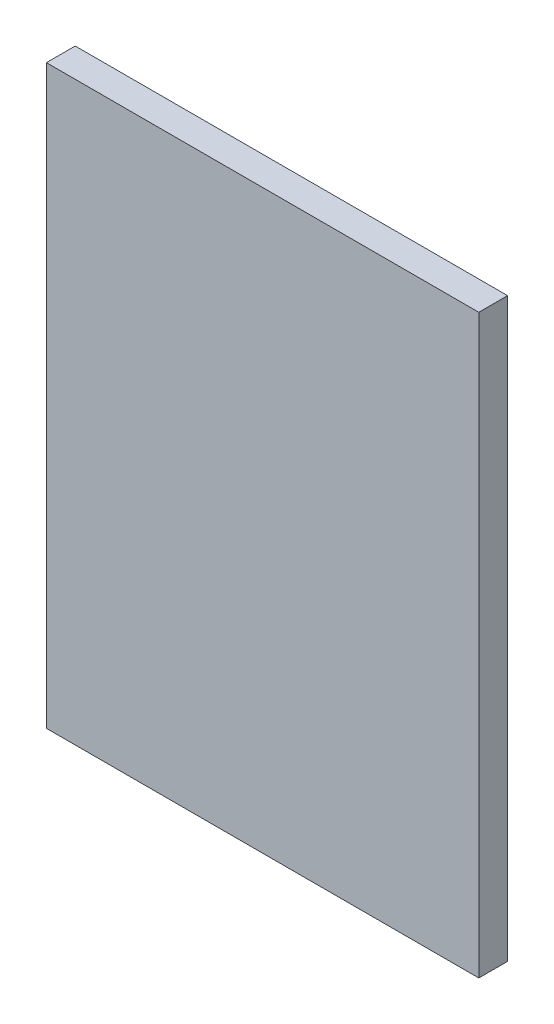
ISO-10303-21;
HEADER;
FILE_DESCRIPTION(('STEP AP214'),'2;1');
FILE_NAME('part.step','',(''),(''),'','','');
FILE_SCHEMA(('AUTOMOTIVE_DESIGN { 1 0 10303 214 1 1 1 1 }'));
ENDSEC;
DATA;
#1=APPLICATION_CONTEXT('core data for automotive mechanical design processes');
#2=APPLICATION_PROTOCOL_DEFINITION('international standard','automotive_design',2000,#1);
#3=PRODUCT_CONTEXT('',#1,'mechanical');
#4=PRODUCT('Part','Part','',(#3));
#5=PRODUCT_RELATED_PRODUCT_CATEGORY('part','',(#4));
#6=PRODUCT_DEFINITION_FORMATION('','',#4);
#7=PRODUCT_DEFINITION_CONTEXT('part definition',#1,'design');
#8=PRODUCT_DEFINITION('design','',#6,#7);
#9=PRODUCT_DEFINITION_SHAPE('','',#8);
#10=(LENGTH_UNIT() NAMED_UNIT(*) SI_UNIT(.MILLI.,.METRE.));
#11=(NAMED_UNIT(*) PLANE_ANGLE_UNIT() SI_UNIT($,.RADIAN.));
#12=(NAMED_UNIT(*) SI_UNIT($,.STERADIAN.) SOLID_ANGLE_UNIT());
#13=UNCERTAINTY_MEASURE_WITH_UNIT(LENGTH_MEASURE(1.E-05),#10,'distance_accuracy_value','');
#14=(GEOMETRIC_REPRESENTATION_CONTEXT(3) GLOBAL_UNCERTAINTY_ASSIGNED_CONTEXT((#13)) GLOBAL_UNIT_ASSIGNED_CONTEXT((#10,
#11,#12)) REPRESENTATION_CONTEXT('',''));
#15=CARTESIAN_POINT('',(0.,0.,0.));
#16=DIRECTION('',(0.,0.,1.));
#17=DIRECTION('',(1.,0.,0.));
#18=AXIS2_PLACEMENT_3D('',#15,#16,#17);
#19=CARTESIAN_POINT('',(7.5,-10.,-1.));
#20=DIRECTION('',(1.,0.,0.));
#21=DIRECTION('',(0.,0.,-1.));
#22=AXIS2_PLACEMENT_3D('',#19,#20,#21);
#23=PLANE('',#22);
#24=DIRECTION('',(0.,1.,0.));
#25=VECTOR('',#24,1.);
#26=CARTESIAN_POINT('',(7.5,-10.,0.));
#27=LINE('',#26,#25);
#28=CARTESIAN_POINT('',(7.5,-10.,0.));
#29=VERTEX_POINT('',#28);
#30=CARTESIAN_POINT('',(7.5,10.,0.));
#31=VERTEX_POINT('',#30);
#32=EDGE_CURVE('E143',#29,#31,#27,.T.);
#33=ORIENTED_EDGE('',*,*,#32,.F.);
#34=DIRECTION('',(0.,0.,1.));
#35=VECTOR('',#34,1.);
#36=CARTESIAN_POINT('',(7.5,-10.,-1.));
#37=LINE('',#36,#35);
#38=CARTESIAN_POINT('',(7.5,-10.,-1.));
#39=VERTEX_POINT('',#38);
#40=EDGE_CURVE('E11',#39,#29,#37,.T.);
#41=ORIENTED_EDGE('',*,*,#40,.F.);
#42=DIRECTION('',(0.,1.,0.));
#43=VECTOR('',#42,1.);
#44=CARTESIAN_POINT('',(7.5,-10.,-1.));
#45=LINE('',#44,#43);
#46=CARTESIAN_POINT('',(7.5,10.,-1.));
#47=VERTEX_POINT('',#46);
#48=EDGE_CURVE('E142',#39,#47,#45,.T.);
#49=ORIENTED_EDGE('',*,*,#48,.T.);
#50=DIRECTION('',(0.,0.,1.));
#51=VECTOR('',#50,1.);
#52=CARTESIAN_POINT('',(7.5,10.,-1.));
#53=LINE('',#52,#51);
#54=EDGE_CURVE('E45',#47,#31,#53,.T.);
#55=ORIENTED_EDGE('',*,*,#54,.T.);
#56=EDGE_LOOP('',(#33,#41,#49,#55));
#57=FACE_BOUND('',#56,.T.);
#58=ADVANCED_FACE('F39',(#57),#23,.T.);
#59=CARTESIAN_POINT('',(-7.5,-10.,-1.));
#60=DIRECTION('',(0.,-1.,0.));
#61=DIRECTION('',(0.,0.,-1.));
#62=AXIS2_PLACEMENT_3D('',#59,#60,#61);
#63=PLANE('',#62);
#64=DIRECTION('',(1.,0.,0.));
#65=VECTOR('',#64,1.);
#66=CARTESIAN_POINT('',(-7.5,-10.,0.));
#67=LINE('',#66,#65);
#68=CARTESIAN_POINT('',(-7.5,-10.,0.));
#69=VERTEX_POINT('',#68);
#70=EDGE_CURVE('E148',#69,#29,#67,.T.);
#71=ORIENTED_EDGE('',*,*,#70,.F.);
#72=DIRECTION('',(0.,0.,1.));
#73=VECTOR('',#72,1.);
#74=CARTESIAN_POINT('',(-7.5,-10.,-1.));
#75=LINE('',#74,#73);
#76=CARTESIAN_POINT('',(-7.5,-10.,-1.));
#77=VERTEX_POINT('',#76);
#78=EDGE_CURVE('E50',#77,#69,#75,.T.);
#79=ORIENTED_EDGE('',*,*,#78,.F.);
#80=DIRECTION('',(1.,0.,0.));
#81=VECTOR('',#80,1.);
#82=CARTESIAN_POINT('',(-7.5,-10.,-1.));
#83=LINE('',#82,#81);
#84=EDGE_CURVE('E155',#77,#39,#83,.T.);
#85=ORIENTED_EDGE('',*,*,#84,.T.);
#86=ORIENTED_EDGE('',*,*,#40,.T.);
#87=EDGE_LOOP('',(#71,#79,#85,#86));
#88=FACE_BOUND('',#87,.T.);
#89=ADVANCED_FACE('F177',(#88),#63,.T.);
#90=CARTESIAN_POINT('',(-7.5,-10.,-1.));
#91=DIRECTION('',(-1.,0.,0.));
#92=DIRECTION('',(0.,0.,1.));
#93=AXIS2_PLACEMENT_3D('',#90,#91,#92);
#94=PLANE('',#93);
#95=DIRECTION('',(0.,-1.,0.));
#96=VECTOR('',#95,1.);
#97=CARTESIAN_POINT('',(-7.5,-10.,0.));
#98=LINE('',#97,#96);
#99=CARTESIAN_POINT('',(-7.5,10.,0.));
#100=VERTEX_POINT('',#99);
#101=EDGE_CURVE('E159',#100,#69,#98,.T.);
#102=ORIENTED_EDGE('',*,*,#101,.F.);
#103=DIRECTION('',(0.,0.,1.));
#104=VECTOR('',#103,1.);
#105=CARTESIAN_POINT('',(-7.5,10.,-1.));
#106=LINE('',#105,#104);
#107=CARTESIAN_POINT('',(-7.5,10.,-1.));
#108=VERTEX_POINT('',#107);
#109=EDGE_CURVE('E164',#108,#100,#106,.T.);
#110=ORIENTED_EDGE('',*,*,#109,.F.);
#111=DIRECTION('',(0.,-1.,0.));
#112=VECTOR('',#111,1.);
#113=CARTESIAN_POINT('',(-7.5,-10.,-1.));
#114=LINE('',#113,#112);
#115=EDGE_CURVE('E149',#108,#77,#114,.T.);
#116=ORIENTED_EDGE('',*,*,#115,.T.);
#117=ORIENTED_EDGE('',*,*,#78,.T.);
#118=EDGE_LOOP('',(#102,#110,#116,#117));
#119=FACE_BOUND('',#118,.T.);
#120=ADVANCED_FACE('F184',(#119),#94,.T.);
#121=CARTESIAN_POINT('',(-7.5,10.,-1.));
#122=DIRECTION('',(0.,1.,0.));
#123=DIRECTION('',(0.,0.,1.));
#124=AXIS2_PLACEMENT_3D('',#121,#122,#123);
#125=PLANE('',#124);
#126=DIRECTION('',(-1.,0.,0.));
#127=VECTOR('',#126,1.);
#128=CARTESIAN_POINT('',(-7.5,10.,0.));
#129=LINE('',#128,#127);
#130=EDGE_CURVE('E160',#31,#100,#129,.T.);
#131=ORIENTED_EDGE('',*,*,#130,.F.);
#132=ORIENTED_EDGE('',*,*,#54,.F.);
#133=DIRECTION('',(-1.,0.,0.));
#134=VECTOR('',#133,1.);
#135=CARTESIAN_POINT('',(-7.5,10.,-1.));
#136=LINE('',#135,#134);
#137=EDGE_CURVE('E144',#47,#108,#136,.T.);
#138=ORIENTED_EDGE('',*,*,#137,.T.);
#139=ORIENTED_EDGE('',*,*,#109,.T.);
#140=EDGE_LOOP('',(#131,#132,#138,#139));
#141=FACE_BOUND('',#140,.T.);
#142=ADVANCED_FACE('F175',(#141),#125,.T.);
#143=CARTESIAN_POINT('',(0.,0.,-1.));
#144=DIRECTION('',(0.,0.,-1.));
#145=DIRECTION('',(-1.,0.,0.));
#146=AXIS2_PLACEMENT_3D('',#143,#144,#145);
#147=PLANE('',#146);
#148=DIRECTION('',(0.,-1.,0.));
#149=VECTOR('',#148,1.);
#150=CARTESIAN_POINT('',(4.875,0.,-1.));
#151=LINE('',#150,#149);
#152=CARTESIAN_POINT('',(4.875,6.,-1.));
#153=VERTEX_POINT('',#152);
#154=CARTESIAN_POINT('',(4.875,-6.,-1.));
#155=VERTEX_POINT('',#154);
#156=EDGE_CURVE('E138',#153,#155,#151,.T.);
#157=ORIENTED_EDGE('',*,*,#156,.F.);
#158=DIRECTION('',(1.,0.,0.));
#159=VECTOR('',#158,1.);
#160=CARTESIAN_POINT('',(0.,6.,-1.));
#161=LINE('',#160,#159);
#162=CARTESIAN_POINT('',(-4.875,6.,-1.));
#163=VERTEX_POINT('',#162);
#164=EDGE_CURVE('E107',#163,#153,#161,.T.);
#165=ORIENTED_EDGE('',*,*,#164,.F.);
#166=DIRECTION('',(0.,1.,0.));
#167=VECTOR('',#166,1.);
#168=CARTESIAN_POINT('',(-4.875,0.,-1.));
#169=LINE('',#168,#167);
#170=CARTESIAN_POINT('',(-4.875,-6.,-1.));
#171=VERTEX_POINT('',#170);
#172=EDGE_CURVE('E58',#171,#163,#169,.T.);
#173=ORIENTED_EDGE('',*,*,#172,.F.);
#174=DIRECTION('',(-1.,0.,0.));
#175=VECTOR('',#174,1.);
#176=CARTESIAN_POINT('',(0.,-6.,-1.));
#177=LINE('',#176,#175);
#178=EDGE_CURVE('E54',#155,#171,#177,.T.);
#179=ORIENTED_EDGE('',*,*,#178,.F.);
#180=EDGE_LOOP('',(#157,#165,#173,#179));
#181=FACE_BOUND('',#180,.T.);
#182=ORIENTED_EDGE('',*,*,#48,.F.);
#183=ORIENTED_EDGE('',*,*,#84,.F.);
#184=ORIENTED_EDGE('',*,*,#115,.F.);
#185=ORIENTED_EDGE('',*,*,#137,.F.);
#186=EDGE_LOOP('',(#182,#183,#184,#185));
#187=FACE_BOUND('',#186,.T.);
#188=ADVANCED_FACE('F182',(#181,#187),#147,.T.);
#189=CARTESIAN_POINT('',(0.,0.,0.));
#190=DIRECTION('',(0.,0.,-1.));
#191=DIRECTION('',(-1.,0.,0.));
#192=AXIS2_PLACEMENT_3D('',#189,#190,#191);
#193=PLANE('',#192);
#194=ORIENTED_EDGE('',*,*,#32,.T.);
#195=ORIENTED_EDGE('',*,*,#130,.T.);
#196=ORIENTED_EDGE('',*,*,#101,.T.);
#197=ORIENTED_EDGE('',*,*,#70,.T.);
#198=EDGE_LOOP('',(#194,#195,#196,#197));
#199=FACE_BOUND('',#198,.T.);
#200=ADVANCED_FACE('F172',(#199),#193,.F.);
#201=CARTESIAN_POINT('',(4.875,-6.,-2.));
#202=DIRECTION('',(1.,0.,0.));
#203=DIRECTION('',(0.,0.,-1.));
#204=AXIS2_PLACEMENT_3D('',#201,#202,#203);
#205=PLANE('',#204);
#206=DIRECTION('',(0.,0.,1.));
#207=VECTOR('',#206,1.);
#208=CARTESIAN_POINT('',(4.875,6.,-2.));
#209=LINE('',#208,#207);
#210=CARTESIAN_POINT('',(4.875,6.,-2.));
#211=VERTEX_POINT('',#210);
#212=EDGE_CURVE('E103',#211,#153,#209,.T.);
#213=ORIENTED_EDGE('',*,*,#212,.T.);
#214=ORIENTED_EDGE('',*,*,#156,.T.);
#215=DIRECTION('',(0.,0.,1.));
#216=VECTOR('',#215,1.);
#217=CARTESIAN_POINT('',(4.875,-6.,-2.));
#218=LINE('',#217,#216);
#219=CARTESIAN_POINT('',(4.875,-6.,-2.));
#220=VERTEX_POINT('',#219);
#221=EDGE_CURVE('E127',#220,#155,#218,.T.);
#222=ORIENTED_EDGE('',*,*,#221,.F.);
#223=DIRECTION('',(0.,1.,0.));
#224=VECTOR('',#223,1.);
#225=CARTESIAN_POINT('',(4.875,-6.,-2.));
#226=LINE('',#225,#224);
#227=EDGE_CURVE('E118',#220,#211,#226,.T.);
#228=ORIENTED_EDGE('',*,*,#227,.T.);
#229=EDGE_LOOP('',(#213,#214,#222,#228));
#230=FACE_BOUND('',#229,.T.);
#231=ADVANCED_FACE('F123',(#230),#205,.T.);
#232=CARTESIAN_POINT('',(-4.875,-6.,-2.));
#233=DIRECTION('',(0.,-1.,0.));
#234=DIRECTION('',(0.,0.,-1.));
#235=AXIS2_PLACEMENT_3D('',#232,#233,#234);
#236=PLANE('',#235);
#237=ORIENTED_EDGE('',*,*,#221,.T.);
#238=ORIENTED_EDGE('',*,*,#178,.T.);
#239=DIRECTION('',(0.,0.,1.));
#240=VECTOR('',#239,1.);
#241=CARTESIAN_POINT('',(-4.875,-6.,-2.));
#242=LINE('',#241,#240);
#243=CARTESIAN_POINT('',(-4.875,-6.,-2.));
#244=VERTEX_POINT('',#243);
#245=EDGE_CURVE('E131',#244,#171,#242,.T.);
#246=ORIENTED_EDGE('',*,*,#245,.F.);
#247=DIRECTION('',(1.,0.,0.));
#248=VECTOR('',#247,1.);
#249=CARTESIAN_POINT('',(-4.875,-6.,-2.));
#250=LINE('',#249,#248);
#251=EDGE_CURVE('E115',#244,#220,#250,.T.);
#252=ORIENTED_EDGE('',*,*,#251,.T.);
#253=EDGE_LOOP('',(#237,#238,#246,#252));
#254=FACE_BOUND('',#253,.T.);
#255=ADVANCED_FACE('F237',(#254),#236,.T.);
#256=CARTESIAN_POINT('',(-4.875,-6.,-2.));
#257=DIRECTION('',(-1.,0.,0.));
#258=DIRECTION('',(0.,0.,1.));
#259=AXIS2_PLACEMENT_3D('',#256,#257,#258);
#260=PLANE('',#259);
#261=ORIENTED_EDGE('',*,*,#245,.T.);
#262=ORIENTED_EDGE('',*,*,#172,.T.);
#263=DIRECTION('',(0.,0.,1.));
#264=VECTOR('',#263,1.);
#265=CARTESIAN_POINT('',(-4.875,6.,-2.));
#266=LINE('',#265,#264);
#267=CARTESIAN_POINT('',(-4.875,6.,-2.));
#268=VERTEX_POINT('',#267);
#269=EDGE_CURVE('E112',#268,#163,#266,.T.);
#270=ORIENTED_EDGE('',*,*,#269,.F.);
#271=DIRECTION('',(0.,-1.,0.));
#272=VECTOR('',#271,1.);
#273=CARTESIAN_POINT('',(-4.875,-6.,-2.));
#274=LINE('',#273,#272);
#275=EDGE_CURVE('E125',#268,#244,#274,.T.);
#276=ORIENTED_EDGE('',*,*,#275,.T.);
#277=EDGE_LOOP('',(#261,#262,#270,#276));
#278=FACE_BOUND('',#277,.T.);
#279=ADVANCED_FACE('F242',(#278),#260,.T.);
#280=CARTESIAN_POINT('',(-4.875,6.,-2.));
#281=DIRECTION('',(0.,1.,0.));
#282=DIRECTION('',(0.,0.,1.));
#283=AXIS2_PLACEMENT_3D('',#280,#281,#282);
#284=PLANE('',#283);
#285=ORIENTED_EDGE('',*,*,#269,.T.);
#286=ORIENTED_EDGE('',*,*,#164,.T.);
#287=ORIENTED_EDGE('',*,*,#212,.F.);
#288=DIRECTION('',(-1.,0.,0.));
#289=VECTOR('',#288,1.);
#290=CARTESIAN_POINT('',(-4.875,6.,-2.));
#291=LINE('',#290,#289);
#292=EDGE_CURVE('E110',#211,#268,#291,.T.);
#293=ORIENTED_EDGE('',*,*,#292,.T.);
#294=EDGE_LOOP('',(#285,#286,#287,#293));
#295=FACE_BOUND('',#294,.T.);
#296=ADVANCED_FACE('F106',(#295),#284,.T.);
#297=CARTESIAN_POINT('',(0.,0.,-2.));
#298=DIRECTION('',(0.,0.,-1.));
#299=DIRECTION('',(-1.,0.,0.));
#300=AXIS2_PLACEMENT_3D('',#297,#298,#299);
#301=PLANE('',#300);
#302=ORIENTED_EDGE('',*,*,#227,.F.);
#303=ORIENTED_EDGE('',*,*,#251,.F.);
#304=ORIENTED_EDGE('',*,*,#275,.F.);
#305=ORIENTED_EDGE('',*,*,#292,.F.);
#306=EDGE_LOOP('',(#302,#303,#304,#305));
#307=FACE_BOUND('',#306,.T.);
#308=ADVANCED_FACE('F116',(#307),#301,.T.);
#309=CLOSED_SHELL('',(#58,#89,#120,#142,#188,#200,#231,#255,#279,#296,#308));
#310=MANIFOLD_SOLID_BREP('B2',#309);
#311=ADVANCED_BREP_SHAPE_REPRESENTATION('',(#18,#310),#14);
#312=SHAPE_DEFINITION_REPRESENTATION(#9,#311);
ENDSEC;
END-ISO-10303-21;
